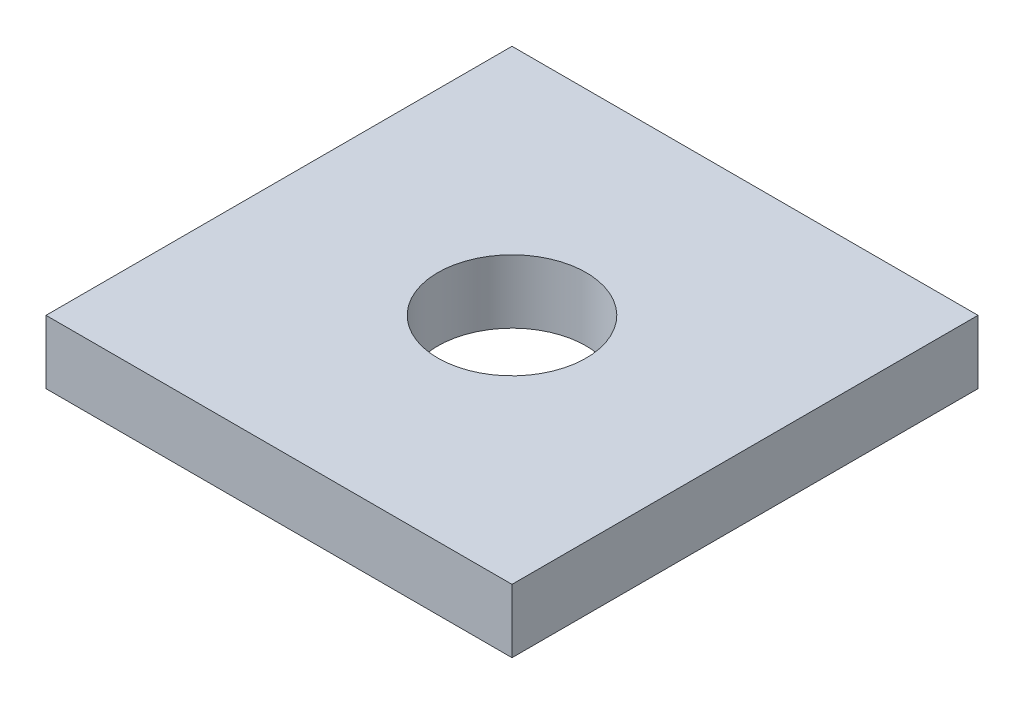
ISO-10303-21;
HEADER;
FILE_DESCRIPTION(('STEP AP214'),'2;1');
FILE_NAME('part.step','',(''),(''),'','','');
FILE_SCHEMA(('AUTOMOTIVE_DESIGN { 1 0 10303 214 1 1 1 1 }'));
ENDSEC;
DATA;
#1=APPLICATION_CONTEXT('core data for automotive mechanical design processes');
#2=APPLICATION_PROTOCOL_DEFINITION('international standard','automotive_design',2000,#1);
#3=PRODUCT_CONTEXT('',#1,'mechanical');
#4=PRODUCT('Part','Part','',(#3));
#5=PRODUCT_RELATED_PRODUCT_CATEGORY('part','',(#4));
#6=PRODUCT_DEFINITION_FORMATION('','',#4);
#7=PRODUCT_DEFINITION_CONTEXT('part definition',#1,'design');
#8=PRODUCT_DEFINITION('design','',#6,#7);
#9=PRODUCT_DEFINITION_SHAPE('','',#8);
#10=(LENGTH_UNIT() NAMED_UNIT(*) SI_UNIT(.MILLI.,.METRE.));
#11=(NAMED_UNIT(*) PLANE_ANGLE_UNIT() SI_UNIT($,.RADIAN.));
#12=(NAMED_UNIT(*) SI_UNIT($,.STERADIAN.) SOLID_ANGLE_UNIT());
#13=UNCERTAINTY_MEASURE_WITH_UNIT(LENGTH_MEASURE(1.E-05),#10,'distance_accuracy_value','');
#14=(GEOMETRIC_REPRESENTATION_CONTEXT(3) GLOBAL_UNCERTAINTY_ASSIGNED_CONTEXT((#13)) GLOBAL_UNIT_ASSIGNED_CONTEXT((#10,
#11,#12)) REPRESENTATION_CONTEXT('',''));
#15=CARTESIAN_POINT('',(0.,0.,0.));
#16=DIRECTION('',(0.,0.,1.));
#17=DIRECTION('',(1.,0.,0.));
#18=AXIS2_PLACEMENT_3D('',#15,#16,#17);
#19=CARTESIAN_POINT('',(0.,3.,0.));
#20=DIRECTION('',(0.,-1.,0.));
#21=DIRECTION('',(0.,0.,-1.));
#22=AXIS2_PLACEMENT_3D('',#19,#20,#21);
#23=PLANE('',#22);
#24=DIRECTION('',(0.,0.,-1.));
#25=VECTOR('',#24,1.);
#26=CARTESIAN_POINT('',(11.,3.,11.));
#27=LINE('',#26,#25);
#28=CARTESIAN_POINT('',(11.,3.,11.));
#29=VERTEX_POINT('',#28);
#30=CARTESIAN_POINT('',(11.,3.,-11.));
#31=VERTEX_POINT('',#30);
#32=EDGE_CURVE('E92',#29,#31,#27,.T.);
#33=ORIENTED_EDGE('',*,*,#32,.T.);
#34=DIRECTION('',(-1.,0.,0.));
#35=VECTOR('',#34,1.);
#36=CARTESIAN_POINT('',(-11.,3.,-11.));
#37=LINE('',#36,#35);
#38=CARTESIAN_POINT('',(-11.,3.,-11.));
#39=VERTEX_POINT('',#38);
#40=EDGE_CURVE('E87',#31,#39,#37,.T.);
#41=ORIENTED_EDGE('',*,*,#40,.T.);
#42=DIRECTION('',(0.,0.,1.));
#43=VECTOR('',#42,1.);
#44=CARTESIAN_POINT('',(-11.,3.,11.));
#45=LINE('',#44,#43);
#46=CARTESIAN_POINT('',(-11.,3.,11.));
#47=VERTEX_POINT('',#46);
#48=EDGE_CURVE('E90',#39,#47,#45,.T.);
#49=ORIENTED_EDGE('',*,*,#48,.T.);
#50=DIRECTION('',(1.,0.,0.));
#51=VECTOR('',#50,1.);
#52=CARTESIAN_POINT('',(-11.,3.,11.));
#53=LINE('',#52,#51);
#54=EDGE_CURVE('E57',#47,#29,#53,.T.);
#55=ORIENTED_EDGE('',*,*,#54,.T.);
#56=EDGE_LOOP('',(#33,#41,#49,#55));
#57=FACE_BOUND('',#56,.T.);
#58=CARTESIAN_POINT('',(0.,3.,0.));
#59=DIRECTION('',(0.,1.,0.));
#60=DIRECTION('',(0.,0.,1.));
#61=AXIS2_PLACEMENT_3D('',#58,#59,#60);
#62=CIRCLE('',#61,3.5);
#63=CARTESIAN_POINT('',(0.,3.,3.5));
#64=VERTEX_POINT('',#63);
#65=EDGE_CURVE('E112',#64,#64,#62,.T.);
#66=ORIENTED_EDGE('',*,*,#65,.F.);
#67=EDGE_LOOP('',(#66));
#68=FACE_BOUND('',#67,.T.);
#69=ADVANCED_FACE('F39',(#57,#68),#23,.F.);
#70=CARTESIAN_POINT('',(0.,0.,0.));
#71=DIRECTION('',(0.,-1.,0.));
#72=DIRECTION('',(0.,0.,-1.));
#73=AXIS2_PLACEMENT_3D('',#70,#71,#72);
#74=PLANE('',#73);
#75=DIRECTION('',(0.,0.,-1.));
#76=VECTOR('',#75,1.);
#77=CARTESIAN_POINT('',(11.,0.,11.));
#78=LINE('',#77,#76);
#79=CARTESIAN_POINT('',(11.,0.,11.));
#80=VERTEX_POINT('',#79);
#81=CARTESIAN_POINT('',(11.,0.,-11.));
#82=VERTEX_POINT('',#81);
#83=EDGE_CURVE('E108',#80,#82,#78,.T.);
#84=ORIENTED_EDGE('',*,*,#83,.F.);
#85=DIRECTION('',(1.,0.,0.));
#86=VECTOR('',#85,1.);
#87=CARTESIAN_POINT('',(-11.,0.,11.));
#88=LINE('',#87,#86);
#89=CARTESIAN_POINT('',(-11.,0.,11.));
#90=VERTEX_POINT('',#89);
#91=EDGE_CURVE('E80',#90,#80,#88,.T.);
#92=ORIENTED_EDGE('',*,*,#91,.F.);
#93=DIRECTION('',(0.,0.,1.));
#94=VECTOR('',#93,1.);
#95=CARTESIAN_POINT('',(-11.,0.,11.));
#96=LINE('',#95,#94);
#97=CARTESIAN_POINT('',(-11.,0.,-11.));
#98=VERTEX_POINT('',#97);
#99=EDGE_CURVE('E74',#98,#90,#96,.T.);
#100=ORIENTED_EDGE('',*,*,#99,.F.);
#101=DIRECTION('',(-1.,0.,0.));
#102=VECTOR('',#101,1.);
#103=CARTESIAN_POINT('',(-11.,0.,-11.));
#104=LINE('',#103,#102);
#105=EDGE_CURVE('E97',#82,#98,#104,.T.);
#106=ORIENTED_EDGE('',*,*,#105,.F.);
#107=EDGE_LOOP('',(#84,#92,#100,#106));
#108=FACE_BOUND('',#107,.T.);
#109=CARTESIAN_POINT('',(0.,0.,0.));
#110=DIRECTION('',(0.,1.,0.));
#111=DIRECTION('',(0.,0.,1.));
#112=AXIS2_PLACEMENT_3D('',#109,#110,#111);
#113=CIRCLE('',#112,3.5);
#114=CARTESIAN_POINT('',(0.,0.,3.5));
#115=VERTEX_POINT('',#114);
#116=EDGE_CURVE('E130',#115,#115,#113,.T.);
#117=ORIENTED_EDGE('',*,*,#116,.T.);
#118=EDGE_LOOP('',(#117));
#119=FACE_BOUND('',#118,.T.);
#120=ADVANCED_FACE('F125',(#108,#119),#74,.T.);
#121=CARTESIAN_POINT('',(11.,3.,11.));
#122=DIRECTION('',(-1.,0.,0.));
#123=DIRECTION('',(0.,0.,1.));
#124=AXIS2_PLACEMENT_3D('',#121,#122,#123);
#125=PLANE('',#124);
#126=ORIENTED_EDGE('',*,*,#83,.T.);
#127=DIRECTION('',(0.,-1.,0.));
#128=VECTOR('',#127,1.);
#129=CARTESIAN_POINT('',(11.,3.,-11.));
#130=LINE('',#129,#128);
#131=EDGE_CURVE('E11',#31,#82,#130,.T.);
#132=ORIENTED_EDGE('',*,*,#131,.F.);
#133=ORIENTED_EDGE('',*,*,#32,.F.);
#134=DIRECTION('',(0.,-1.,0.));
#135=VECTOR('',#134,1.);
#136=CARTESIAN_POINT('',(11.,3.,11.));
#137=LINE('',#136,#135);
#138=EDGE_CURVE('E104',#29,#80,#137,.T.);
#139=ORIENTED_EDGE('',*,*,#138,.T.);
#140=EDGE_LOOP('',(#126,#132,#133,#139));
#141=FACE_BOUND('',#140,.T.);
#142=ADVANCED_FACE('F41',(#141),#125,.F.);
#143=CARTESIAN_POINT('',(-11.,3.,-11.));
#144=DIRECTION('',(0.,0.,1.));
#145=DIRECTION('',(1.,0.,0.));
#146=AXIS2_PLACEMENT_3D('',#143,#144,#145);
#147=PLANE('',#146);
#148=ORIENTED_EDGE('',*,*,#105,.T.);
#149=DIRECTION('',(0.,-1.,0.));
#150=VECTOR('',#149,1.);
#151=CARTESIAN_POINT('',(-11.,3.,-11.));
#152=LINE('',#151,#150);
#153=EDGE_CURVE('E49',#39,#98,#152,.T.);
#154=ORIENTED_EDGE('',*,*,#153,.F.);
#155=ORIENTED_EDGE('',*,*,#40,.F.);
#156=ORIENTED_EDGE('',*,*,#131,.T.);
#157=EDGE_LOOP('',(#148,#154,#155,#156));
#158=FACE_BOUND('',#157,.T.);
#159=ADVANCED_FACE('F96',(#158),#147,.F.);
#160=CARTESIAN_POINT('',(-11.,3.,11.));
#161=DIRECTION('',(1.,0.,0.));
#162=DIRECTION('',(0.,0.,-1.));
#163=AXIS2_PLACEMENT_3D('',#160,#161,#162);
#164=PLANE('',#163);
#165=ORIENTED_EDGE('',*,*,#99,.T.);
#166=DIRECTION('',(0.,-1.,0.));
#167=VECTOR('',#166,1.);
#168=CARTESIAN_POINT('',(-11.,3.,11.));
#169=LINE('',#168,#167);
#170=EDGE_CURVE('E99',#47,#90,#169,.T.);
#171=ORIENTED_EDGE('',*,*,#170,.F.);
#172=ORIENTED_EDGE('',*,*,#48,.F.);
#173=ORIENTED_EDGE('',*,*,#153,.T.);
#174=EDGE_LOOP('',(#165,#171,#172,#173));
#175=FACE_BOUND('',#174,.T.);
#176=ADVANCED_FACE('F100',(#175),#164,.F.);
#177=CARTESIAN_POINT('',(-11.,3.,11.));
#178=DIRECTION('',(0.,0.,-1.));
#179=DIRECTION('',(-1.,0.,0.));
#180=AXIS2_PLACEMENT_3D('',#177,#178,#179);
#181=PLANE('',#180);
#182=ORIENTED_EDGE('',*,*,#91,.T.);
#183=ORIENTED_EDGE('',*,*,#138,.F.);
#184=ORIENTED_EDGE('',*,*,#54,.F.);
#185=ORIENTED_EDGE('',*,*,#170,.T.);
#186=EDGE_LOOP('',(#182,#183,#184,#185));
#187=FACE_BOUND('',#186,.T.);
#188=ADVANCED_FACE('F122',(#187),#181,.F.);
#189=CARTESIAN_POINT('',(0.,3.,0.));
#190=DIRECTION('',(0.,-1.,0.));
#191=DIRECTION('',(0.,0.,-1.));
#192=AXIS2_PLACEMENT_3D('',#189,#190,#191);
#193=CYLINDRICAL_SURFACE('',#192,3.5);
#194=ORIENTED_EDGE('',*,*,#65,.T.);
#195=EDGE_LOOP('',(#194));
#196=FACE_BOUND('',#195,.T.);
#197=ORIENTED_EDGE('',*,*,#116,.F.);
#198=EDGE_LOOP('',(#197));
#199=FACE_BOUND('',#198,.T.);
#200=ADVANCED_FACE('F138',(#196,#199),#193,.F.);
#201=CLOSED_SHELL('',(#69,#120,#142,#159,#176,#188,#200));
#202=MANIFOLD_SOLID_BREP('B2',#201);
#203=ADVANCED_BREP_SHAPE_REPRESENTATION('',(#18,#202),#14);
#204=SHAPE_DEFINITION_REPRESENTATION(#9,#203);
ENDSEC;
END-ISO-10303-21;
